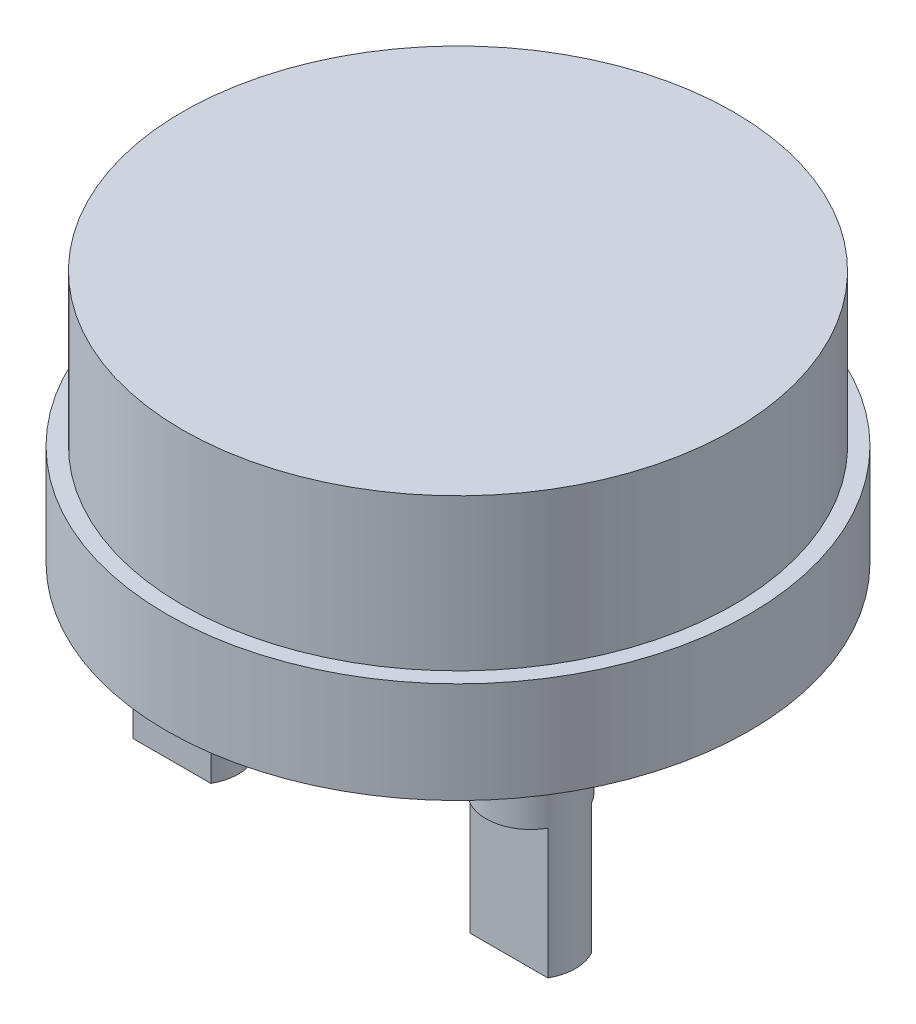
ISO-10303-21;
HEADER;
FILE_DESCRIPTION(('STEP AP214'),'2;1');
FILE_NAME('part.step','',(''),(''),'','','');
FILE_SCHEMA(('AUTOMOTIVE_DESIGN { 1 0 10303 214 1 1 1 1 }'));
ENDSEC;
DATA;
#1=APPLICATION_CONTEXT('core data for automotive mechanical design processes');
#2=APPLICATION_PROTOCOL_DEFINITION('international standard','automotive_design',2000,#1);
#3=PRODUCT_CONTEXT('',#1,'mechanical');
#4=PRODUCT('Part','Part','',(#3));
#5=PRODUCT_RELATED_PRODUCT_CATEGORY('part','',(#4));
#6=PRODUCT_DEFINITION_FORMATION('','',#4);
#7=PRODUCT_DEFINITION_CONTEXT('part definition',#1,'design');
#8=PRODUCT_DEFINITION('design','',#6,#7);
#9=PRODUCT_DEFINITION_SHAPE('','',#8);
#10=(LENGTH_UNIT() NAMED_UNIT(*) SI_UNIT(.MILLI.,.METRE.));
#11=(NAMED_UNIT(*) PLANE_ANGLE_UNIT() SI_UNIT($,.RADIAN.));
#12=(NAMED_UNIT(*) SI_UNIT($,.STERADIAN.) SOLID_ANGLE_UNIT());
#13=UNCERTAINTY_MEASURE_WITH_UNIT(LENGTH_MEASURE(1.E-05),#10,'distance_accuracy_value','');
#14=(GEOMETRIC_REPRESENTATION_CONTEXT(3) GLOBAL_UNCERTAINTY_ASSIGNED_CONTEXT((#13)) GLOBAL_UNIT_ASSIGNED_CONTEXT((#10,
#11,#12)) REPRESENTATION_CONTEXT('',''));
#15=CARTESIAN_POINT('',(0.,0.,0.));
#16=DIRECTION('',(0.,0.,1.));
#17=DIRECTION('',(1.,0.,0.));
#18=AXIS2_PLACEMENT_3D('',#15,#16,#17);
#19=CARTESIAN_POINT('',(-10.,-10.,5.68));
#20=DIRECTION('',(0.,-1.,0.));
#21=DIRECTION('',(0.,0.,-1.));
#22=AXIS2_PLACEMENT_3D('',#19,#20,#21);
#23=PLANE('',#22);
#24=DIRECTION('',(-1.,0.,0.));
#25=VECTOR('',#24,1.);
#26=CARTESIAN_POINT('',(-12.3092206477511,-10.,6.98));
#27=LINE('',#26,#25);
#28=CARTESIAN_POINT('',(-7.69077935224891,-10.,6.98));
#29=VERTEX_POINT('',#28);
#30=CARTESIAN_POINT('',(-12.3092206477511,-10.,6.98));
#31=VERTEX_POINT('',#30);
#32=EDGE_CURVE('E121',#29,#31,#27,.T.);
#33=ORIENTED_EDGE('',*,*,#32,.F.);
#34=CARTESIAN_POINT('',(-10.,-10.,5.68));
#35=DIRECTION('',(0.,-1.,0.));
#36=DIRECTION('',(0.,0.,-1.));
#37=AXIS2_PLACEMENT_3D('',#34,#35,#36);
#38=CIRCLE('',#37,2.65);
#39=EDGE_CURVE('E58',#29,#31,#38,.T.);
#40=ORIENTED_EDGE('',*,*,#39,.T.);
#41=EDGE_LOOP('',(#33,#40));
#42=FACE_BOUND('',#41,.T.);
#43=ADVANCED_FACE('F35',(#42),#23,.T.);
#44=CARTESIAN_POINT('',(10.,-10.,5.68));
#45=DIRECTION('',(0.,1.,0.));
#46=DIRECTION('',(0.,0.,1.));
#47=AXIS2_PLACEMENT_3D('',#44,#45,#46);
#48=PLANE('',#47);
#49=DIRECTION('',(1.,0.,0.));
#50=VECTOR('',#49,1.);
#51=CARTESIAN_POINT('',(12.3092206477511,-10.,4.38));
#52=LINE('',#51,#50);
#53=CARTESIAN_POINT('',(7.6907793522489,-10.,4.38));
#54=VERTEX_POINT('',#53);
#55=CARTESIAN_POINT('',(12.3092206477511,-10.,4.38));
#56=VERTEX_POINT('',#55);
#57=EDGE_CURVE('E129',#54,#56,#52,.T.);
#58=ORIENTED_EDGE('',*,*,#57,.F.);
#59=CARTESIAN_POINT('',(10.,-10.,5.68));
#60=DIRECTION('',(0.,-1.,0.));
#61=DIRECTION('',(0.,0.,1.));
#62=AXIS2_PLACEMENT_3D('',#59,#60,#61);
#63=CIRCLE('',#62,2.65);
#64=EDGE_CURVE('E161',#54,#56,#63,.T.);
#65=ORIENTED_EDGE('',*,*,#64,.T.);
#66=EDGE_LOOP('',(#58,#65));
#67=FACE_BOUND('',#66,.T.);
#68=ADVANCED_FACE('F217',(#67),#48,.F.);
#69=DIRECTION('',(-1.,0.,0.));
#70=VECTOR('',#69,1.);
#71=CARTESIAN_POINT('',(12.3092206477511,-10.,6.98));
#72=LINE('',#71,#70);
#73=CARTESIAN_POINT('',(12.3092206477511,-10.,6.98));
#74=VERTEX_POINT('',#73);
#75=CARTESIAN_POINT('',(7.6907793522489,-10.,6.98));
#76=VERTEX_POINT('',#75);
#77=EDGE_CURVE('E126',#74,#76,#72,.T.);
#78=ORIENTED_EDGE('',*,*,#77,.F.);
#79=EDGE_CURVE('E159',#74,#76,#63,.T.);
#80=ORIENTED_EDGE('',*,*,#79,.T.);
#81=EDGE_LOOP('',(#78,#80));
#82=FACE_BOUND('',#81,.T.);
#83=ADVANCED_FACE('F223',(#82),#48,.F.);
#84=CARTESIAN_POINT('',(0.,9.,0.));
#85=DIRECTION('',(0.,-1.,0.));
#86=DIRECTION('',(0.,0.,-1.));
#87=AXIS2_PLACEMENT_3D('',#84,#85,#86);
#88=CYLINDRICAL_SURFACE('',#87,16.35);
#89=CARTESIAN_POINT('',(0.,9.,0.));
#90=DIRECTION('',(0.,1.,0.));
#91=DIRECTION('',(0.,0.,1.));
#92=AXIS2_PLACEMENT_3D('',#89,#90,#91);
#93=CIRCLE('',#92,16.35);
#94=CARTESIAN_POINT('',(0.,9.,16.35));
#95=VERTEX_POINT('',#94);
#96=EDGE_CURVE('E44',#95,#95,#93,.T.);
#97=ORIENTED_EDGE('',*,*,#96,.F.);
#98=EDGE_LOOP('',(#97));
#99=FACE_BOUND('',#98,.T.);
#100=CARTESIAN_POINT('',(0.,0.,0.));
#101=DIRECTION('',(0.,1.,0.));
#102=DIRECTION('',(0.,0.,1.));
#103=AXIS2_PLACEMENT_3D('',#100,#101,#102);
#104=CIRCLE('',#103,16.35);
#105=CARTESIAN_POINT('',(0.,0.,16.35));
#106=VERTEX_POINT('',#105);
#107=EDGE_CURVE('E39',#106,#106,#104,.T.);
#108=ORIENTED_EDGE('',*,*,#107,.T.);
#109=EDGE_LOOP('',(#108));
#110=FACE_BOUND('',#109,.T.);
#111=ADVANCED_FACE('F37',(#99,#110),#88,.T.);
#112=CARTESIAN_POINT('',(0.,9.,0.));
#113=DIRECTION('',(0.,1.,0.));
#114=DIRECTION('',(0.,0.,1.));
#115=AXIS2_PLACEMENT_3D('',#112,#113,#114);
#116=PLANE('',#115);
#117=ORIENTED_EDGE('',*,*,#96,.T.);
#118=EDGE_LOOP('',(#117));
#119=FACE_BOUND('',#118,.T.);
#120=ADVANCED_FACE('F205',(#119),#116,.T.);
#121=CARTESIAN_POINT('',(0.,-6.,0.));
#122=DIRECTION('',(0.,1.,0.));
#123=DIRECTION('',(0.,0.,1.));
#124=AXIS2_PLACEMENT_3D('',#121,#122,#123);
#125=CYLINDRICAL_SURFACE('',#124,17.29);
#126=CARTESIAN_POINT('',(0.,-6.,0.));
#127=DIRECTION('',(0.,-1.,0.));
#128=DIRECTION('',(0.,0.,-1.));
#129=AXIS2_PLACEMENT_3D('',#126,#127,#128);
#130=CIRCLE('',#129,17.29);
#131=CARTESIAN_POINT('',(0.,-6.,-17.29));
#132=VERTEX_POINT('',#131);
#133=EDGE_CURVE('E184',#132,#132,#130,.T.);
#134=ORIENTED_EDGE('',*,*,#133,.F.);
#135=EDGE_LOOP('',(#134));
#136=FACE_BOUND('',#135,.T.);
#137=CARTESIAN_POINT('',(0.,0.,0.));
#138=DIRECTION('',(0.,-1.,0.));
#139=DIRECTION('',(0.,0.,-1.));
#140=AXIS2_PLACEMENT_3D('',#137,#138,#139);
#141=CIRCLE('',#140,17.29);
#142=CARTESIAN_POINT('',(0.,0.,-17.29));
#143=VERTEX_POINT('',#142);
#144=EDGE_CURVE('E182',#143,#143,#141,.T.);
#145=ORIENTED_EDGE('',*,*,#144,.T.);
#146=EDGE_LOOP('',(#145));
#147=FACE_BOUND('',#146,.T.);
#148=ADVANCED_FACE('F203',(#136,#147),#125,.T.);
#149=CARTESIAN_POINT('',(0.,-6.,0.));
#150=DIRECTION('',(0.,-1.,0.));
#151=DIRECTION('',(0.,0.,-1.));
#152=AXIS2_PLACEMENT_3D('',#149,#150,#151);
#153=PLANE('',#152);
#154=CARTESIAN_POINT('',(10.,-6.,5.68));
#155=DIRECTION('',(0.,-1.,0.));
#156=DIRECTION('',(0.,0.,1.));
#157=AXIS2_PLACEMENT_3D('',#154,#155,#156);
#158=CIRCLE('',#157,2.65);
#159=CARTESIAN_POINT('',(10.,-6.,8.33));
#160=VERTEX_POINT('',#159);
#161=EDGE_CURVE('E158',#160,#160,#158,.T.);
#162=ORIENTED_EDGE('',*,*,#161,.F.);
#163=EDGE_LOOP('',(#162));
#164=FACE_BOUND('',#163,.T.);
#165=CARTESIAN_POINT('',(6.6,-6.,-9.56));
#166=DIRECTION('',(0.,-1.,0.));
#167=DIRECTION('',(0.,0.,1.));
#168=AXIS2_PLACEMENT_3D('',#165,#166,#167);
#169=CIRCLE('',#168,1.9);
#170=CARTESIAN_POINT('',(6.6,-6.,-7.66));
#171=VERTEX_POINT('',#170);
#172=EDGE_CURVE('E168',#171,#171,#169,.T.);
#173=ORIENTED_EDGE('',*,*,#172,.F.);
#174=EDGE_LOOP('',(#173));
#175=FACE_BOUND('',#174,.T.);
#176=CARTESIAN_POINT('',(-10.,-6.,5.68));
#177=DIRECTION('',(0.,-1.,0.));
#178=DIRECTION('',(0.,0.,-1.));
#179=AXIS2_PLACEMENT_3D('',#176,#177,#178);
#180=CIRCLE('',#179,2.65);
#181=CARTESIAN_POINT('',(-10.,-6.,3.03));
#182=VERTEX_POINT('',#181);
#183=EDGE_CURVE('E167',#182,#182,#180,.T.);
#184=ORIENTED_EDGE('',*,*,#183,.F.);
#185=EDGE_LOOP('',(#184));
#186=FACE_BOUND('',#185,.T.);
#187=CARTESIAN_POINT('',(-6.6,-6.,-9.56));
#188=DIRECTION('',(0.,-1.,0.));
#189=DIRECTION('',(0.,0.,-1.));
#190=AXIS2_PLACEMENT_3D('',#187,#188,#189);
#191=CIRCLE('',#190,1.9);
#192=CARTESIAN_POINT('',(-6.6,-6.,-11.46));
#193=VERTEX_POINT('',#192);
#194=EDGE_CURVE('E178',#193,#193,#191,.T.);
#195=ORIENTED_EDGE('',*,*,#194,.F.);
#196=EDGE_LOOP('',(#195));
#197=FACE_BOUND('',#196,.T.);
#198=CARTESIAN_POINT('',(0.,-6.,0.));
#199=DIRECTION('',(0.,-1.,0.));
#200=DIRECTION('',(0.,0.,-1.));
#201=AXIS2_PLACEMENT_3D('',#198,#199,#200);
#202=CIRCLE('',#201,5.5);
#203=CARTESIAN_POINT('',(0.,-6.,-5.5));
#204=VERTEX_POINT('',#203);
#205=EDGE_CURVE('E11',#204,#204,#202,.T.);
#206=ORIENTED_EDGE('',*,*,#205,.F.);
#207=EDGE_LOOP('',(#206));
#208=FACE_BOUND('',#207,.T.);
#209=ORIENTED_EDGE('',*,*,#133,.T.);
#210=EDGE_LOOP('',(#209));
#211=FACE_BOUND('',#210,.T.);
#212=ADVANCED_FACE('F199',(#164,#175,#186,#197,#208,#211),#153,.T.);
#213=CARTESIAN_POINT('',(0.,0.,0.));
#214=DIRECTION('',(0.,-1.,0.));
#215=DIRECTION('',(0.,0.,-1.));
#216=AXIS2_PLACEMENT_3D('',#213,#214,#215);
#217=PLANE('',#216);
#218=ORIENTED_EDGE('',*,*,#107,.F.);
#219=EDGE_LOOP('',(#218));
#220=FACE_BOUND('',#219,.T.);
#221=ORIENTED_EDGE('',*,*,#144,.F.);
#222=EDGE_LOOP('',(#221));
#223=FACE_BOUND('',#222,.T.);
#224=ADVANCED_FACE('F195',(#220,#223),#217,.F.);
#225=CARTESIAN_POINT('',(0.,-10.,0.));
#226=DIRECTION('',(0.,1.,0.));
#227=DIRECTION('',(0.,0.,1.));
#228=AXIS2_PLACEMENT_3D('',#225,#226,#227);
#229=CYLINDRICAL_SURFACE('',#228,5.5);
#230=CARTESIAN_POINT('',(0.,-10.,0.));
#231=DIRECTION('',(0.,-1.,0.));
#232=DIRECTION('',(0.,0.,-1.));
#233=AXIS2_PLACEMENT_3D('',#230,#231,#232);
#234=CIRCLE('',#233,5.5);
#235=CARTESIAN_POINT('',(0.,-10.,-5.5));
#236=VERTEX_POINT('',#235);
#237=EDGE_CURVE('E177',#236,#236,#234,.T.);
#238=ORIENTED_EDGE('',*,*,#237,.F.);
#239=EDGE_LOOP('',(#238));
#240=FACE_BOUND('',#239,.T.);
#241=ORIENTED_EDGE('',*,*,#205,.T.);
#242=EDGE_LOOP('',(#241));
#243=FACE_BOUND('',#242,.T.);
#244=ADVANCED_FACE('F198',(#240,#243),#229,.T.);
#245=CARTESIAN_POINT('',(0.,-10.,0.));
#246=DIRECTION('',(0.,-1.,0.));
#247=DIRECTION('',(0.,0.,-1.));
#248=AXIS2_PLACEMENT_3D('',#245,#246,#247);
#249=PLANE('',#248);
#250=ORIENTED_EDGE('',*,*,#237,.T.);
#251=EDGE_LOOP('',(#250));
#252=FACE_BOUND('',#251,.T.);
#253=ADVANCED_FACE('F246',(#252),#249,.T.);
#254=CARTESIAN_POINT('',(-6.6,-10.,-9.56));
#255=DIRECTION('',(0.,1.,0.));
#256=DIRECTION('',(0.,0.,1.));
#257=AXIS2_PLACEMENT_3D('',#254,#255,#256);
#258=CYLINDRICAL_SURFACE('',#257,1.9);
#259=CARTESIAN_POINT('',(-6.6,-10.,-9.56));
#260=DIRECTION('',(0.,-1.,0.));
#261=DIRECTION('',(0.,0.,-1.));
#262=AXIS2_PLACEMENT_3D('',#259,#260,#261);
#263=CIRCLE('',#262,1.9);
#264=CARTESIAN_POINT('',(-6.6,-10.,-11.46));
#265=VERTEX_POINT('',#264);
#266=EDGE_CURVE('E174',#265,#265,#263,.T.);
#267=ORIENTED_EDGE('',*,*,#266,.F.);
#268=EDGE_LOOP('',(#267));
#269=FACE_BOUND('',#268,.T.);
#270=ORIENTED_EDGE('',*,*,#194,.T.);
#271=EDGE_LOOP('',(#270));
#272=FACE_BOUND('',#271,.T.);
#273=ADVANCED_FACE('F240',(#269,#272),#258,.T.);
#274=CARTESIAN_POINT('',(-6.6,-10.,-9.56));
#275=DIRECTION('',(0.,-1.,0.));
#276=DIRECTION('',(0.,0.,-1.));
#277=AXIS2_PLACEMENT_3D('',#274,#275,#276);
#278=PLANE('',#277);
#279=ORIENTED_EDGE('',*,*,#266,.T.);
#280=EDGE_LOOP('',(#279));
#281=FACE_BOUND('',#280,.T.);
#282=ADVANCED_FACE('F236',(#281),#278,.T.);
#283=CARTESIAN_POINT('',(-10.,-10.,5.68));
#284=DIRECTION('',(0.,1.,0.));
#285=DIRECTION('',(0.,0.,1.));
#286=AXIS2_PLACEMENT_3D('',#283,#284,#285);
#287=CYLINDRICAL_SURFACE('',#286,2.65);
#288=ORIENTED_EDGE('',*,*,#39,.F.);
#289=DIRECTION('',(0.,1.,0.));
#290=VECTOR('',#289,1.);
#291=CARTESIAN_POINT('',(-7.6907793522489,-17.7,6.98));
#292=LINE('',#291,#290);
#293=CARTESIAN_POINT('',(-7.6907793522489,-17.7,6.98));
#294=VERTEX_POINT('',#293);
#295=EDGE_CURVE('E131',#294,#29,#292,.T.);
#296=ORIENTED_EDGE('',*,*,#295,.F.);
#297=CARTESIAN_POINT('',(-10.,-17.7,5.68));
#298=DIRECTION('',(0.,-1.,0.));
#299=DIRECTION('',(0.,0.,-1.));
#300=AXIS2_PLACEMENT_3D('',#297,#298,#299);
#301=CIRCLE('',#300,2.65);
#302=CARTESIAN_POINT('',(-7.6907793522489,-17.7,4.38));
#303=VERTEX_POINT('',#302);
#304=EDGE_CURVE('E111',#303,#294,#301,.T.);
#305=ORIENTED_EDGE('',*,*,#304,.F.);
#306=DIRECTION('',(0.,1.,0.));
#307=VECTOR('',#306,1.);
#308=CARTESIAN_POINT('',(-7.6907793522489,-17.7,4.38));
#309=LINE('',#308,#307);
#310=CARTESIAN_POINT('',(-7.6907793522489,-10.,4.38));
#311=VERTEX_POINT('',#310);
#312=EDGE_CURVE('E108',#303,#311,#309,.T.);
#313=ORIENTED_EDGE('',*,*,#312,.T.);
#314=CARTESIAN_POINT('',(-12.3092206477511,-10.,4.38));
#315=VERTEX_POINT('',#314);
#316=EDGE_CURVE('E125',#315,#311,#38,.T.);
#317=ORIENTED_EDGE('',*,*,#316,.F.);
#318=DIRECTION('',(0.,1.,0.));
#319=VECTOR('',#318,1.);
#320=CARTESIAN_POINT('',(-12.3092206477511,-17.7,4.38));
#321=LINE('',#320,#319);
#322=CARTESIAN_POINT('',(-12.3092206477511,-17.7,4.38));
#323=VERTEX_POINT('',#322);
#324=EDGE_CURVE('E106',#323,#315,#321,.T.);
#325=ORIENTED_EDGE('',*,*,#324,.F.);
#326=CARTESIAN_POINT('',(-10.,-17.7,5.68));
#327=DIRECTION('',(0.,-1.,0.));
#328=DIRECTION('',(0.,0.,-1.));
#329=AXIS2_PLACEMENT_3D('',#326,#327,#328);
#330=CIRCLE('',#329,2.65);
#331=CARTESIAN_POINT('',(-12.3092206477511,-17.7,6.98));
#332=VERTEX_POINT('',#331);
#333=EDGE_CURVE('E112',#332,#323,#330,.T.);
#334=ORIENTED_EDGE('',*,*,#333,.F.);
#335=DIRECTION('',(0.,1.,0.));
#336=VECTOR('',#335,1.);
#337=CARTESIAN_POINT('',(-12.3092206477511,-17.7,6.98));
#338=LINE('',#337,#336);
#339=EDGE_CURVE('E388',#332,#31,#338,.T.);
#340=ORIENTED_EDGE('',*,*,#339,.T.);
#341=EDGE_LOOP('',(#288,#296,#305,#313,#317,#325,#334,#340));
#342=FACE_BOUND('',#341,.T.);
#343=ORIENTED_EDGE('',*,*,#183,.T.);
#344=EDGE_LOOP('',(#343));
#345=FACE_BOUND('',#344,.T.);
#346=ADVANCED_FACE('F123',(#342,#345),#287,.T.);
#347=DIRECTION('',(1.,0.,0.));
#348=VECTOR('',#347,1.);
#349=CARTESIAN_POINT('',(-12.3092206477511,-10.,4.38));
#350=LINE('',#349,#348);
#351=EDGE_CURVE('E51',#315,#311,#350,.T.);
#352=ORIENTED_EDGE('',*,*,#351,.F.);
#353=ORIENTED_EDGE('',*,*,#316,.T.);
#354=EDGE_LOOP('',(#352,#353));
#355=FACE_BOUND('',#354,.T.);
#356=ADVANCED_FACE('F219',(#355),#23,.T.);
#357=CARTESIAN_POINT('',(6.6,-10.,-9.56));
#358=DIRECTION('',(0.,1.,0.));
#359=DIRECTION('',(0.,0.,1.));
#360=AXIS2_PLACEMENT_3D('',#357,#358,#359);
#361=CYLINDRICAL_SURFACE('',#360,1.9);
#362=CARTESIAN_POINT('',(6.6,-10.,-9.56));
#363=DIRECTION('',(0.,-1.,0.));
#364=DIRECTION('',(0.,0.,1.));
#365=AXIS2_PLACEMENT_3D('',#362,#363,#364);
#366=CIRCLE('',#365,1.9);
#367=CARTESIAN_POINT('',(6.6,-10.,-7.66));
#368=VERTEX_POINT('',#367);
#369=EDGE_CURVE('E164',#368,#368,#366,.T.);
#370=ORIENTED_EDGE('',*,*,#369,.F.);
#371=EDGE_LOOP('',(#370));
#372=FACE_BOUND('',#371,.T.);
#373=ORIENTED_EDGE('',*,*,#172,.T.);
#374=EDGE_LOOP('',(#373));
#375=FACE_BOUND('',#374,.T.);
#376=ADVANCED_FACE('F229',(#372,#375),#361,.T.);
#377=CARTESIAN_POINT('',(6.6,-10.,-9.56));
#378=DIRECTION('',(0.,1.,0.));
#379=DIRECTION('',(0.,0.,1.));
#380=AXIS2_PLACEMENT_3D('',#377,#378,#379);
#381=PLANE('',#380);
#382=ORIENTED_EDGE('',*,*,#369,.T.);
#383=EDGE_LOOP('',(#382));
#384=FACE_BOUND('',#383,.T.);
#385=ADVANCED_FACE('F234',(#384),#381,.F.);
#386=CARTESIAN_POINT('',(10.,-10.,5.68));
#387=DIRECTION('',(0.,1.,0.));
#388=DIRECTION('',(0.,0.,1.));
#389=AXIS2_PLACEMENT_3D('',#386,#387,#388);
#390=CYLINDRICAL_SURFACE('',#389,2.65);
#391=ORIENTED_EDGE('',*,*,#64,.F.);
#392=DIRECTION('',(0.,1.,0.));
#393=VECTOR('',#392,1.);
#394=CARTESIAN_POINT('',(7.6907793522489,-17.7,4.38));
#395=LINE('',#394,#393);
#396=CARTESIAN_POINT('',(7.6907793522489,-17.7,4.38));
#397=VERTEX_POINT('',#396);
#398=EDGE_CURVE('E149',#397,#54,#395,.T.);
#399=ORIENTED_EDGE('',*,*,#398,.F.);
#400=CARTESIAN_POINT('',(10.,-17.7,5.68));
#401=DIRECTION('',(0.,-1.,0.));
#402=DIRECTION('',(0.,0.,1.));
#403=AXIS2_PLACEMENT_3D('',#400,#401,#402);
#404=CIRCLE('',#403,2.65);
#405=CARTESIAN_POINT('',(7.6907793522489,-17.7,6.98));
#406=VERTEX_POINT('',#405);
#407=EDGE_CURVE('E140',#406,#397,#404,.T.);
#408=ORIENTED_EDGE('',*,*,#407,.F.);
#409=DIRECTION('',(0.,1.,0.));
#410=VECTOR('',#409,1.);
#411=CARTESIAN_POINT('',(7.6907793522489,-17.7,6.98));
#412=LINE('',#411,#410);
#413=EDGE_CURVE('E152',#406,#76,#412,.T.);
#414=ORIENTED_EDGE('',*,*,#413,.T.);
#415=ORIENTED_EDGE('',*,*,#79,.F.);
#416=DIRECTION('',(0.,1.,0.));
#417=VECTOR('',#416,1.);
#418=CARTESIAN_POINT('',(12.3092206477511,-17.7,6.98));
#419=LINE('',#418,#417);
#420=CARTESIAN_POINT('',(12.3092206477511,-17.7,6.98));
#421=VERTEX_POINT('',#420);
#422=EDGE_CURVE('E155',#421,#74,#419,.T.);
#423=ORIENTED_EDGE('',*,*,#422,.F.);
#424=CARTESIAN_POINT('',(10.,-17.7,5.68));
#425=DIRECTION('',(0.,-1.,0.));
#426=DIRECTION('',(0.,0.,1.));
#427=AXIS2_PLACEMENT_3D('',#424,#425,#426);
#428=CIRCLE('',#427,2.65);
#429=CARTESIAN_POINT('',(12.3092206477511,-17.7,4.38));
#430=VERTEX_POINT('',#429);
#431=EDGE_CURVE('E135',#430,#421,#428,.T.);
#432=ORIENTED_EDGE('',*,*,#431,.F.);
#433=DIRECTION('',(0.,1.,0.));
#434=VECTOR('',#433,1.);
#435=CARTESIAN_POINT('',(12.3092206477511,-17.7,4.38));
#436=LINE('',#435,#434);
#437=EDGE_CURVE('E143',#430,#56,#436,.T.);
#438=ORIENTED_EDGE('',*,*,#437,.T.);
#439=EDGE_LOOP('',(#391,#399,#408,#414,#415,#423,#432,#438));
#440=FACE_BOUND('',#439,.T.);
#441=ORIENTED_EDGE('',*,*,#161,.T.);
#442=EDGE_LOOP('',(#441));
#443=FACE_BOUND('',#442,.T.);
#444=ADVANCED_FACE('F291',(#440,#443),#390,.T.);
#445=CARTESIAN_POINT('',(12.3092206477511,-17.7,6.98));
#446=DIRECTION('',(0.,0.,-1.));
#447=DIRECTION('',(-1.,0.,0.));
#448=AXIS2_PLACEMENT_3D('',#445,#446,#447);
#449=PLANE('',#448);
#450=ORIENTED_EDGE('',*,*,#77,.T.);
#451=ORIENTED_EDGE('',*,*,#413,.F.);
#452=DIRECTION('',(-1.,0.,0.));
#453=VECTOR('',#452,1.);
#454=CARTESIAN_POINT('',(12.3092206477511,-17.7,6.98));
#455=LINE('',#454,#453);
#456=EDGE_CURVE('E138',#421,#406,#455,.T.);
#457=ORIENTED_EDGE('',*,*,#456,.F.);
#458=ORIENTED_EDGE('',*,*,#422,.T.);
#459=EDGE_LOOP('',(#450,#451,#457,#458));
#460=FACE_BOUND('',#459,.T.);
#461=ADVANCED_FACE('F327',(#460),#449,.F.);
#462=CARTESIAN_POINT('',(12.3092206477511,-17.7,4.38));
#463=DIRECTION('',(0.,0.,1.));
#464=DIRECTION('',(1.,0.,0.));
#465=AXIS2_PLACEMENT_3D('',#462,#463,#464);
#466=PLANE('',#465);
#467=ORIENTED_EDGE('',*,*,#57,.T.);
#468=ORIENTED_EDGE('',*,*,#437,.F.);
#469=DIRECTION('',(1.,0.,0.));
#470=VECTOR('',#469,1.);
#471=CARTESIAN_POINT('',(12.3092206477511,-17.7,4.38));
#472=LINE('',#471,#470);
#473=EDGE_CURVE('E142',#397,#430,#472,.T.);
#474=ORIENTED_EDGE('',*,*,#473,.F.);
#475=ORIENTED_EDGE('',*,*,#398,.T.);
#476=EDGE_LOOP('',(#467,#468,#474,#475));
#477=FACE_BOUND('',#476,.T.);
#478=ADVANCED_FACE('F337',(#477),#466,.F.);
#479=CARTESIAN_POINT('',(10.,-17.7,5.68));
#480=DIRECTION('',(0.,1.,0.));
#481=DIRECTION('',(0.,0.,1.));
#482=AXIS2_PLACEMENT_3D('',#479,#480,#481);
#483=PLANE('',#482);
#484=ORIENTED_EDGE('',*,*,#431,.T.);
#485=ORIENTED_EDGE('',*,*,#456,.T.);
#486=ORIENTED_EDGE('',*,*,#407,.T.);
#487=ORIENTED_EDGE('',*,*,#473,.T.);
#488=EDGE_LOOP('',(#484,#485,#486,#487));
#489=FACE_BOUND('',#488,.T.);
#490=ADVANCED_FACE('F347',(#489),#483,.F.);
#491=CARTESIAN_POINT('',(-12.3092206477511,-17.7,4.38));
#492=DIRECTION('',(0.,0.,1.));
#493=DIRECTION('',(1.,0.,0.));
#494=AXIS2_PLACEMENT_3D('',#491,#492,#493);
#495=PLANE('',#494);
#496=ORIENTED_EDGE('',*,*,#351,.T.);
#497=ORIENTED_EDGE('',*,*,#312,.F.);
#498=DIRECTION('',(1.,0.,0.));
#499=VECTOR('',#498,1.);
#500=CARTESIAN_POINT('',(-12.3092206477511,-17.7,4.38));
#501=LINE('',#500,#499);
#502=EDGE_CURVE('E102',#323,#303,#501,.T.);
#503=ORIENTED_EDGE('',*,*,#502,.F.);
#504=ORIENTED_EDGE('',*,*,#324,.T.);
#505=EDGE_LOOP('',(#496,#497,#503,#504));
#506=FACE_BOUND('',#505,.T.);
#507=ADVANCED_FACE('F104',(#506),#495,.F.);
#508=CARTESIAN_POINT('',(-12.3092206477511,-17.7,6.98));
#509=DIRECTION('',(0.,0.,-1.));
#510=DIRECTION('',(-1.,0.,0.));
#511=AXIS2_PLACEMENT_3D('',#508,#509,#510);
#512=PLANE('',#511);
#513=ORIENTED_EDGE('',*,*,#32,.T.);
#514=ORIENTED_EDGE('',*,*,#339,.F.);
#515=DIRECTION('',(-1.,0.,0.));
#516=VECTOR('',#515,1.);
#517=CARTESIAN_POINT('',(-12.3092206477511,-17.7,6.98));
#518=LINE('',#517,#516);
#519=EDGE_CURVE('E117',#294,#332,#518,.T.);
#520=ORIENTED_EDGE('',*,*,#519,.F.);
#521=ORIENTED_EDGE('',*,*,#295,.T.);
#522=EDGE_LOOP('',(#513,#514,#520,#521));
#523=FACE_BOUND('',#522,.T.);
#524=ADVANCED_FACE('F366',(#523),#512,.F.);
#525=CARTESIAN_POINT('',(-10.,-17.7,5.68));
#526=DIRECTION('',(0.,-1.,0.));
#527=DIRECTION('',(0.,0.,-1.));
#528=AXIS2_PLACEMENT_3D('',#525,#526,#527);
#529=PLANE('',#528);
#530=ORIENTED_EDGE('',*,*,#333,.T.);
#531=ORIENTED_EDGE('',*,*,#502,.T.);
#532=ORIENTED_EDGE('',*,*,#304,.T.);
#533=ORIENTED_EDGE('',*,*,#519,.T.);
#534=EDGE_LOOP('',(#530,#531,#532,#533));
#535=FACE_BOUND('',#534,.T.);
#536=ADVANCED_FACE('F115',(#535),#529,.T.);
#537=CLOSED_SHELL('',(#43,#68,#83,#111,#120,#148,#212,#224,#244,#253,#273,#282,#346,#356,#376,
#385,#444,#461,#478,#490,#507,#524,#536));
#538=MANIFOLD_SOLID_BREP('B2',#537);
#539=ADVANCED_BREP_SHAPE_REPRESENTATION('',(#18,#538),#14);
#540=SHAPE_DEFINITION_REPRESENTATION(#9,#539);
ENDSEC;
END-ISO-10303-21;
